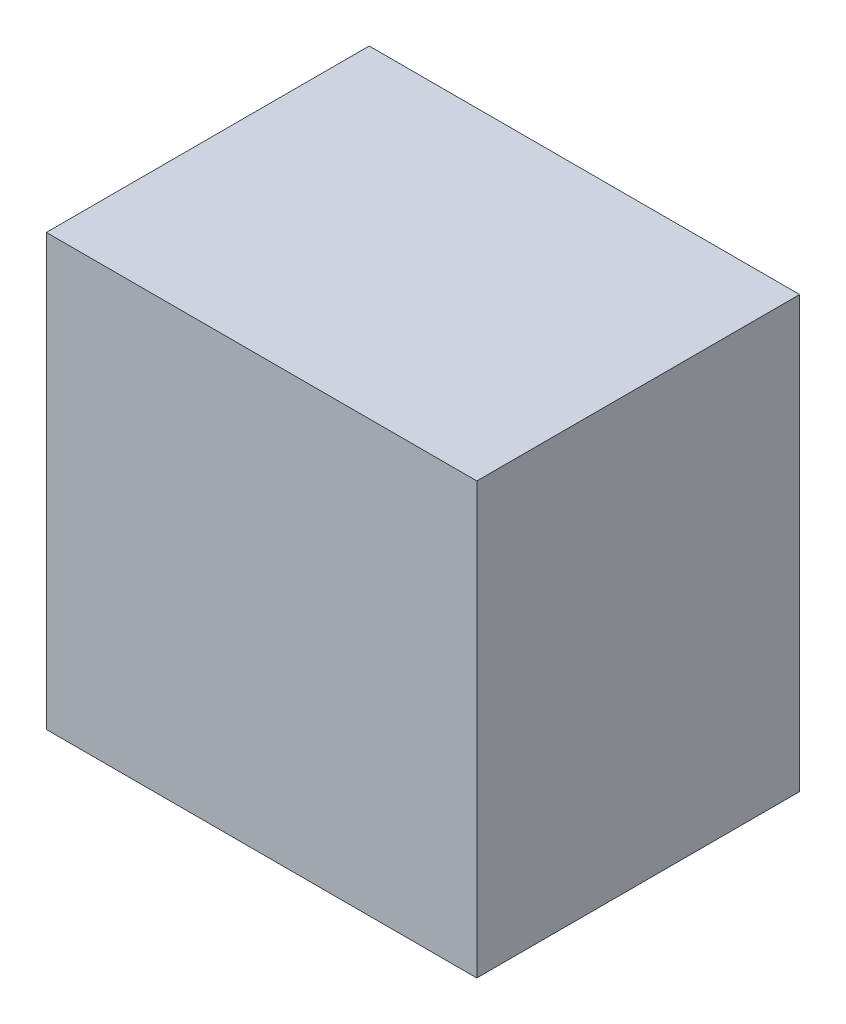
ISO-10303-21;
HEADER;
FILE_DESCRIPTION(('STEP AP214'),'2;1');
FILE_NAME('part.step','',(''),(''),'','','');
FILE_SCHEMA(('AUTOMOTIVE_DESIGN { 1 0 10303 214 1 1 1 1 }'));
ENDSEC;
DATA;
#1=APPLICATION_CONTEXT('core data for automotive mechanical design processes');
#2=APPLICATION_PROTOCOL_DEFINITION('international standard','automotive_design',2000,#1);
#3=PRODUCT_CONTEXT('',#1,'mechanical');
#4=PRODUCT('Part','Part','',(#3));
#5=PRODUCT_RELATED_PRODUCT_CATEGORY('part','',(#4));
#6=PRODUCT_DEFINITION_FORMATION('','',#4);
#7=PRODUCT_DEFINITION_CONTEXT('part definition',#1,'design');
#8=PRODUCT_DEFINITION('design','',#6,#7);
#9=PRODUCT_DEFINITION_SHAPE('','',#8);
#10=(LENGTH_UNIT() NAMED_UNIT(*) SI_UNIT(.MILLI.,.METRE.));
#11=(NAMED_UNIT(*) PLANE_ANGLE_UNIT() SI_UNIT($,.RADIAN.));
#12=(NAMED_UNIT(*) SI_UNIT($,.STERADIAN.) SOLID_ANGLE_UNIT());
#13=UNCERTAINTY_MEASURE_WITH_UNIT(LENGTH_MEASURE(1.E-05),#10,'distance_accuracy_value','');
#14=(GEOMETRIC_REPRESENTATION_CONTEXT(3) GLOBAL_UNCERTAINTY_ASSIGNED_CONTEXT((#13)) GLOBAL_UNIT_ASSIGNED_CONTEXT((#10,
#11,#12)) REPRESENTATION_CONTEXT('',''));
#15=CARTESIAN_POINT('',(0.,0.,0.));
#16=DIRECTION('',(0.,0.,1.));
#17=DIRECTION('',(1.,0.,0.));
#18=AXIS2_PLACEMENT_3D('',#15,#16,#17);
#19=CARTESIAN_POINT('',(0.,0.,-15.));
#20=DIRECTION('',(-1.,0.,0.));
#21=DIRECTION('',(0.,0.,1.));
#22=AXIS2_PLACEMENT_3D('',#19,#20,#21);
#23=PLANE('',#22);
#24=DIRECTION('',(0.,0.,-1.));
#25=VECTOR('',#24,1.);
#26=CARTESIAN_POINT('',(0.,10.,12.));
#27=LINE('',#26,#25);
#28=CARTESIAN_POINT('',(0.,10.,12.));
#29=VERTEX_POINT('',#28);
#30=CARTESIAN_POINT('',(0.,10.,-5.));
#31=VERTEX_POINT('',#30);
#32=EDGE_CURVE('E125',#29,#31,#27,.T.);
#33=ORIENTED_EDGE('',*,*,#32,.F.);
#34=DIRECTION('',(0.,-1.,0.));
#35=VECTOR('',#34,1.);
#36=CARTESIAN_POINT('',(0.,0.,12.));
#37=LINE('',#36,#35);
#38=CARTESIAN_POINT('',(0.,0.,12.));
#39=VERTEX_POINT('',#38);
#40=EDGE_CURVE('E154',#29,#39,#37,.T.);
#41=ORIENTED_EDGE('',*,*,#40,.T.);
#42=DIRECTION('',(0.,0.,1.));
#43=VECTOR('',#42,1.);
#44=CARTESIAN_POINT('',(0.,0.,-15.));
#45=LINE('',#44,#43);
#46=CARTESIAN_POINT('',(0.,0.,15.));
#47=VERTEX_POINT('',#46);
#48=EDGE_CURVE('E147',#39,#47,#45,.T.);
#49=ORIENTED_EDGE('',*,*,#48,.T.);
#50=DIRECTION('',(0.,-1.,0.));
#51=VECTOR('',#50,1.);
#52=CARTESIAN_POINT('',(0.,0.,15.));
#53=LINE('',#52,#51);
#54=CARTESIAN_POINT('',(0.,40.,15.));
#55=VERTEX_POINT('',#54);
#56=EDGE_CURVE('E120',#55,#47,#53,.T.);
#57=ORIENTED_EDGE('',*,*,#56,.F.);
#58=DIRECTION('',(0.,0.,1.));
#59=VECTOR('',#58,1.);
#60=CARTESIAN_POINT('',(0.,40.,-15.));
#61=LINE('',#60,#59);
#62=CARTESIAN_POINT('',(0.,40.,-15.));
#63=VERTEX_POINT('',#62);
#64=EDGE_CURVE('E11',#63,#55,#61,.T.);
#65=ORIENTED_EDGE('',*,*,#64,.F.);
#66=DIRECTION('',(0.,-1.,0.));
#67=VECTOR('',#66,1.);
#68=CARTESIAN_POINT('',(0.,0.,-15.));
#69=LINE('',#68,#67);
#70=CARTESIAN_POINT('',(0.,0.,-15.));
#71=VERTEX_POINT('',#70);
#72=EDGE_CURVE('E137',#63,#71,#69,.T.);
#73=ORIENTED_EDGE('',*,*,#72,.T.);
#74=CARTESIAN_POINT('',(0.,0.,-5.));
#75=VERTEX_POINT('',#74);
#76=EDGE_CURVE('E38',#71,#75,#45,.T.);
#77=ORIENTED_EDGE('',*,*,#76,.T.);
#78=DIRECTION('',(0.,-1.,0.));
#79=VECTOR('',#78,1.);
#80=CARTESIAN_POINT('',(0.,0.,-5.));
#81=LINE('',#80,#79);
#82=EDGE_CURVE('E51',#31,#75,#81,.T.);
#83=ORIENTED_EDGE('',*,*,#82,.F.);
#84=EDGE_LOOP('',(#33,#41,#49,#57,#65,#73,#77,#83));
#85=FACE_BOUND('',#84,.T.);
#86=ADVANCED_FACE('F35',(#85),#23,.T.);
#87=CARTESIAN_POINT('',(0.,0.,-15.));
#88=DIRECTION('',(0.,-1.,0.));
#89=DIRECTION('',(0.,0.,-1.));
#90=AXIS2_PLACEMENT_3D('',#87,#88,#89);
#91=PLANE('',#90);
#92=ORIENTED_EDGE('',*,*,#48,.F.);
#93=DIRECTION('',(1.,0.,0.));
#94=VECTOR('',#93,1.);
#95=CARTESIAN_POINT('',(0.,0.,12.));
#96=LINE('',#95,#94);
#97=CARTESIAN_POINT('',(10.,0.,12.));
#98=VERTEX_POINT('',#97);
#99=EDGE_CURVE('E119',#39,#98,#96,.T.);
#100=ORIENTED_EDGE('',*,*,#99,.T.);
#101=DIRECTION('',(0.,0.,-1.));
#102=VECTOR('',#101,1.);
#103=CARTESIAN_POINT('',(10.,0.,12.));
#104=LINE('',#103,#102);
#105=CARTESIAN_POINT('',(10.,0.,-5.));
#106=VERTEX_POINT('',#105);
#107=EDGE_CURVE('E104',#98,#106,#104,.T.);
#108=ORIENTED_EDGE('',*,*,#107,.T.);
#109=DIRECTION('',(1.,0.,0.));
#110=VECTOR('',#109,1.);
#111=CARTESIAN_POINT('',(0.,0.,-5.));
#112=LINE('',#111,#110);
#113=EDGE_CURVE('E110',#75,#106,#112,.T.);
#114=ORIENTED_EDGE('',*,*,#113,.F.);
#115=ORIENTED_EDGE('',*,*,#76,.F.);
#116=DIRECTION('',(1.,0.,0.));
#117=VECTOR('',#116,1.);
#118=CARTESIAN_POINT('',(0.,0.,-15.));
#119=LINE('',#118,#117);
#120=CARTESIAN_POINT('',(40.,0.,-15.));
#121=VERTEX_POINT('',#120);
#122=EDGE_CURVE('E139',#71,#121,#119,.T.);
#123=ORIENTED_EDGE('',*,*,#122,.T.);
#124=DIRECTION('',(0.,0.,1.));
#125=VECTOR('',#124,1.);
#126=CARTESIAN_POINT('',(40.,0.,-15.));
#127=LINE('',#126,#125);
#128=CARTESIAN_POINT('',(40.,0.,15.));
#129=VERTEX_POINT('',#128);
#130=EDGE_CURVE('E149',#121,#129,#127,.T.);
#131=ORIENTED_EDGE('',*,*,#130,.T.);
#132=DIRECTION('',(1.,0.,0.));
#133=VECTOR('',#132,1.);
#134=CARTESIAN_POINT('',(0.,0.,15.));
#135=LINE('',#134,#133);
#136=EDGE_CURVE('E123',#47,#129,#135,.T.);
#137=ORIENTED_EDGE('',*,*,#136,.F.);
#138=EDGE_LOOP('',(#92,#100,#108,#114,#115,#123,#131,#137));
#139=FACE_BOUND('',#138,.T.);
#140=ADVANCED_FACE('F118',(#139),#91,.T.);
#141=CARTESIAN_POINT('',(0.,40.,-15.));
#142=DIRECTION('',(0.,1.,0.));
#143=DIRECTION('',(0.,0.,1.));
#144=AXIS2_PLACEMENT_3D('',#141,#142,#143);
#145=PLANE('',#144);
#146=ORIENTED_EDGE('',*,*,#64,.T.);
#147=DIRECTION('',(-1.,0.,0.));
#148=VECTOR('',#147,1.);
#149=CARTESIAN_POINT('',(0.,40.,15.));
#150=LINE('',#149,#148);
#151=CARTESIAN_POINT('',(40.,40.,15.));
#152=VERTEX_POINT('',#151);
#153=EDGE_CURVE('E134',#152,#55,#150,.T.);
#154=ORIENTED_EDGE('',*,*,#153,.F.);
#155=DIRECTION('',(0.,0.,1.));
#156=VECTOR('',#155,1.);
#157=CARTESIAN_POINT('',(40.,40.,-15.));
#158=LINE('',#157,#156);
#159=CARTESIAN_POINT('',(40.,40.,-15.));
#160=VERTEX_POINT('',#159);
#161=EDGE_CURVE('E43',#160,#152,#158,.T.);
#162=ORIENTED_EDGE('',*,*,#161,.F.);
#163=DIRECTION('',(-1.,0.,0.));
#164=VECTOR('',#163,1.);
#165=CARTESIAN_POINT('',(0.,40.,-15.));
#166=LINE('',#165,#164);
#167=EDGE_CURVE('E145',#160,#63,#166,.T.);
#168=ORIENTED_EDGE('',*,*,#167,.T.);
#169=EDGE_LOOP('',(#146,#154,#162,#168));
#170=FACE_BOUND('',#169,.T.);
#171=ADVANCED_FACE('F160',(#170),#145,.T.);
#172=CARTESIAN_POINT('',(40.,0.,-15.));
#173=DIRECTION('',(1.,0.,0.));
#174=DIRECTION('',(0.,0.,-1.));
#175=AXIS2_PLACEMENT_3D('',#172,#173,#174);
#176=PLANE('',#175);
#177=ORIENTED_EDGE('',*,*,#161,.T.);
#178=DIRECTION('',(0.,1.,0.));
#179=VECTOR('',#178,1.);
#180=CARTESIAN_POINT('',(40.,0.,15.));
#181=LINE('',#180,#179);
#182=EDGE_CURVE('E131',#129,#152,#181,.T.);
#183=ORIENTED_EDGE('',*,*,#182,.F.);
#184=ORIENTED_EDGE('',*,*,#130,.F.);
#185=DIRECTION('',(0.,1.,0.));
#186=VECTOR('',#185,1.);
#187=CARTESIAN_POINT('',(40.,0.,-15.));
#188=LINE('',#187,#186);
#189=EDGE_CURVE('E142',#121,#160,#188,.T.);
#190=ORIENTED_EDGE('',*,*,#189,.T.);
#191=EDGE_LOOP('',(#177,#183,#184,#190));
#192=FACE_BOUND('',#191,.T.);
#193=ADVANCED_FACE('F167',(#192),#176,.T.);
#194=CARTESIAN_POINT('',(0.,0.,-15.));
#195=DIRECTION('',(0.,0.,-1.));
#196=DIRECTION('',(-1.,0.,0.));
#197=AXIS2_PLACEMENT_3D('',#194,#195,#196);
#198=PLANE('',#197);
#199=ORIENTED_EDGE('',*,*,#72,.F.);
#200=ORIENTED_EDGE('',*,*,#167,.F.);
#201=ORIENTED_EDGE('',*,*,#189,.F.);
#202=ORIENTED_EDGE('',*,*,#122,.F.);
#203=EDGE_LOOP('',(#199,#200,#201,#202));
#204=FACE_BOUND('',#203,.T.);
#205=ADVANCED_FACE('F164',(#204),#198,.T.);
#206=CARTESIAN_POINT('',(0.,0.,15.));
#207=DIRECTION('',(0.,0.,-1.));
#208=DIRECTION('',(-1.,0.,0.));
#209=AXIS2_PLACEMENT_3D('',#206,#207,#208);
#210=PLANE('',#209);
#211=ORIENTED_EDGE('',*,*,#56,.T.);
#212=ORIENTED_EDGE('',*,*,#136,.T.);
#213=ORIENTED_EDGE('',*,*,#182,.T.);
#214=ORIENTED_EDGE('',*,*,#153,.T.);
#215=EDGE_LOOP('',(#211,#212,#213,#214));
#216=FACE_BOUND('',#215,.T.);
#217=ADVANCED_FACE('F157',(#216),#210,.F.);
#218=CARTESIAN_POINT('',(10.,0.,12.));
#219=DIRECTION('',(-1.,0.,0.));
#220=DIRECTION('',(0.,0.,1.));
#221=AXIS2_PLACEMENT_3D('',#218,#219,#220);
#222=PLANE('',#221);
#223=ORIENTED_EDGE('',*,*,#107,.F.);
#224=DIRECTION('',(0.,1.,0.));
#225=VECTOR('',#224,1.);
#226=CARTESIAN_POINT('',(10.,0.,12.));
#227=LINE('',#226,#225);
#228=CARTESIAN_POINT('',(10.,10.,12.));
#229=VERTEX_POINT('',#228);
#230=EDGE_CURVE('E253',#98,#229,#227,.T.);
#231=ORIENTED_EDGE('',*,*,#230,.T.);
#232=DIRECTION('',(0.,0.,-1.));
#233=VECTOR('',#232,1.);
#234=CARTESIAN_POINT('',(10.,10.,12.));
#235=LINE('',#234,#233);
#236=CARTESIAN_POINT('',(10.,10.,-5.));
#237=VERTEX_POINT('',#236);
#238=EDGE_CURVE('E107',#229,#237,#235,.T.);
#239=ORIENTED_EDGE('',*,*,#238,.T.);
#240=DIRECTION('',(0.,1.,0.));
#241=VECTOR('',#240,1.);
#242=CARTESIAN_POINT('',(10.,0.,-5.));
#243=LINE('',#242,#241);
#244=EDGE_CURVE('E101',#106,#237,#243,.T.);
#245=ORIENTED_EDGE('',*,*,#244,.F.);
#246=EDGE_LOOP('',(#223,#231,#239,#245));
#247=FACE_BOUND('',#246,.T.);
#248=ADVANCED_FACE('F102',(#247),#222,.T.);
#249=CARTESIAN_POINT('',(0.,10.,12.));
#250=DIRECTION('',(0.,-1.,0.));
#251=DIRECTION('',(0.,0.,-1.));
#252=AXIS2_PLACEMENT_3D('',#249,#250,#251);
#253=PLANE('',#252);
#254=ORIENTED_EDGE('',*,*,#238,.F.);
#255=DIRECTION('',(-1.,0.,0.));
#256=VECTOR('',#255,1.);
#257=CARTESIAN_POINT('',(0.,10.,12.));
#258=LINE('',#257,#256);
#259=EDGE_CURVE('E251',#229,#29,#258,.T.);
#260=ORIENTED_EDGE('',*,*,#259,.T.);
#261=ORIENTED_EDGE('',*,*,#32,.T.);
#262=DIRECTION('',(-1.,0.,0.));
#263=VECTOR('',#262,1.);
#264=CARTESIAN_POINT('',(0.,10.,-5.));
#265=LINE('',#264,#263);
#266=EDGE_CURVE('E109',#237,#31,#265,.T.);
#267=ORIENTED_EDGE('',*,*,#266,.F.);
#268=EDGE_LOOP('',(#254,#260,#261,#267));
#269=FACE_BOUND('',#268,.T.);
#270=ADVANCED_FACE('F220',(#269),#253,.T.);
#271=CARTESIAN_POINT('',(0.,0.,12.));
#272=DIRECTION('',(0.,0.,-1.));
#273=DIRECTION('',(-1.,0.,0.));
#274=AXIS2_PLACEMENT_3D('',#271,#272,#273);
#275=PLANE('',#274);
#276=ORIENTED_EDGE('',*,*,#40,.F.);
#277=ORIENTED_EDGE('',*,*,#259,.F.);
#278=ORIENTED_EDGE('',*,*,#230,.F.);
#279=ORIENTED_EDGE('',*,*,#99,.F.);
#280=EDGE_LOOP('',(#276,#277,#278,#279));
#281=FACE_BOUND('',#280,.T.);
#282=ADVANCED_FACE('F228',(#281),#275,.T.);
#283=CARTESIAN_POINT('',(0.,0.,-5.));
#284=DIRECTION('',(0.,0.,-1.));
#285=DIRECTION('',(-1.,0.,0.));
#286=AXIS2_PLACEMENT_3D('',#283,#284,#285);
#287=PLANE('',#286);
#288=ORIENTED_EDGE('',*,*,#82,.T.);
#289=ORIENTED_EDGE('',*,*,#113,.T.);
#290=ORIENTED_EDGE('',*,*,#244,.T.);
#291=ORIENTED_EDGE('',*,*,#266,.T.);
#292=EDGE_LOOP('',(#288,#289,#290,#291));
#293=FACE_BOUND('',#292,.T.);
#294=ADVANCED_FACE('F112',(#293),#287,.F.);
#295=CLOSED_SHELL('',(#86,#140,#171,#193,#205,#217,#248,#270,#282,#294));
#296=MANIFOLD_SOLID_BREP('B2',#295);
#297=ADVANCED_BREP_SHAPE_REPRESENTATION('',(#18,#296),#14);
#298=SHAPE_DEFINITION_REPRESENTATION(#9,#297);
ENDSEC;
END-ISO-10303-21;
